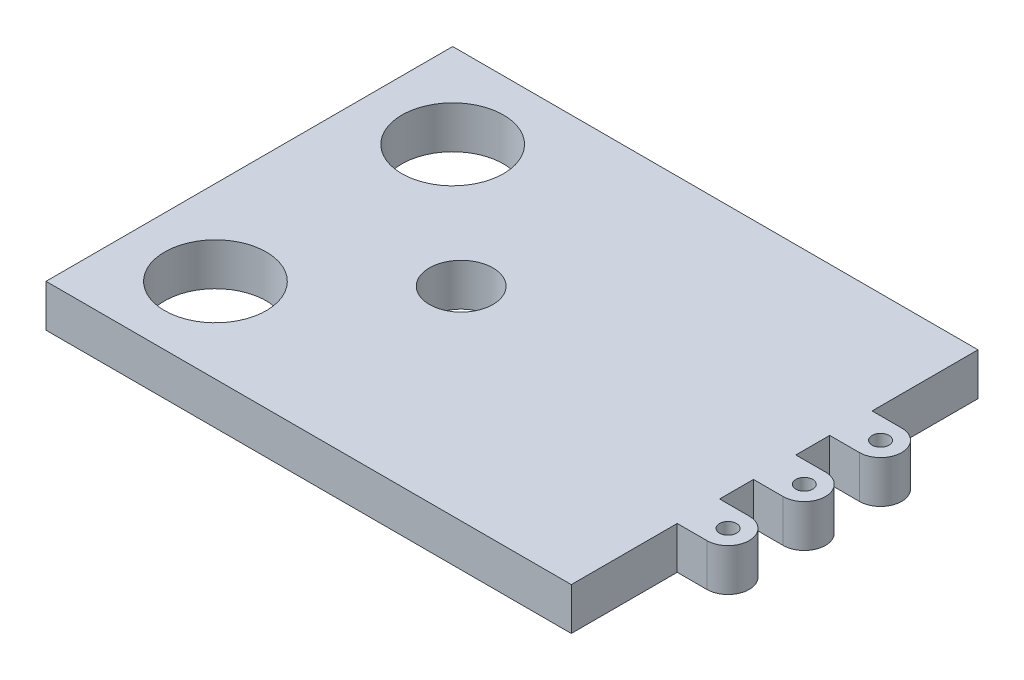
ISO-10303-21;
HEADER;
FILE_DESCRIPTION(('STEP AP214'),'2;1');
FILE_NAME('part.step','',(''),(''),'','','');
FILE_SCHEMA(('AUTOMOTIVE_DESIGN { 1 0 10303 214 1 1 1 1 }'));
ENDSEC;
DATA;
#1=APPLICATION_CONTEXT('core data for automotive mechanical design processes');
#2=APPLICATION_PROTOCOL_DEFINITION('international standard','automotive_design',2000,#1);
#3=PRODUCT_CONTEXT('',#1,'mechanical');
#4=PRODUCT('Part','Part','',(#3));
#5=PRODUCT_RELATED_PRODUCT_CATEGORY('part','',(#4));
#6=PRODUCT_DEFINITION_FORMATION('','',#4);
#7=PRODUCT_DEFINITION_CONTEXT('part definition',#1,'design');
#8=PRODUCT_DEFINITION('design','',#6,#7);
#9=PRODUCT_DEFINITION_SHAPE('','',#8);
#10=(LENGTH_UNIT() NAMED_UNIT(*) SI_UNIT(.MILLI.,.METRE.));
#11=(NAMED_UNIT(*) PLANE_ANGLE_UNIT() SI_UNIT($,.RADIAN.));
#12=(NAMED_UNIT(*) SI_UNIT($,.STERADIAN.) SOLID_ANGLE_UNIT());
#13=UNCERTAINTY_MEASURE_WITH_UNIT(LENGTH_MEASURE(1.E-05),#10,'distance_accuracy_value','');
#14=(GEOMETRIC_REPRESENTATION_CONTEXT(3) GLOBAL_UNCERTAINTY_ASSIGNED_CONTEXT((#13)) GLOBAL_UNIT_ASSIGNED_CONTEXT((#10,
#11,#12)) REPRESENTATION_CONTEXT('',''));
#15=CARTESIAN_POINT('',(0.,0.,0.));
#16=DIRECTION('',(0.,0.,1.));
#17=DIRECTION('',(1.,0.,0.));
#18=AXIS2_PLACEMENT_3D('',#15,#16,#17);
#19=CARTESIAN_POINT('',(0.,5.,-12.5));
#20=DIRECTION('',(0.,0.,1.));
#21=DIRECTION('',(1.,0.,0.));
#22=AXIS2_PLACEMENT_3D('',#19,#20,#21);
#23=PLANE('',#22);
#24=DIRECTION('',(-1.,0.,0.));
#25=VECTOR('',#24,1.);
#26=CARTESIAN_POINT('',(0.,0.,-12.5));
#27=LINE('',#26,#25);
#28=CARTESIAN_POINT('',(65.5,0.,-12.5));
#29=VERTEX_POINT('',#28);
#30=CARTESIAN_POINT('',(62.,0.,-12.5));
#31=VERTEX_POINT('',#30);
#32=EDGE_CURVE('E196',#29,#31,#27,.T.);
#33=ORIENTED_EDGE('',*,*,#32,.F.);
#34=DIRECTION('',(0.,-1.,0.));
#35=VECTOR('',#34,1.);
#36=CARTESIAN_POINT('',(65.5,5.,-12.5));
#37=LINE('',#36,#35);
#38=CARTESIAN_POINT('',(65.5,5.,-12.5));
#39=VERTEX_POINT('',#38);
#40=EDGE_CURVE('E11',#39,#29,#37,.T.);
#41=ORIENTED_EDGE('',*,*,#40,.F.);
#42=DIRECTION('',(-1.,0.,0.));
#43=VECTOR('',#42,1.);
#44=CARTESIAN_POINT('',(0.,5.,-12.5));
#45=LINE('',#44,#43);
#46=CARTESIAN_POINT('',(62.,5.,-12.5));
#47=VERTEX_POINT('',#46);
#48=EDGE_CURVE('E567',#39,#47,#45,.T.);
#49=ORIENTED_EDGE('',*,*,#48,.T.);
#50=DIRECTION('',(0.,-1.,0.));
#51=VECTOR('',#50,1.);
#52=CARTESIAN_POINT('',(62.,5.,-12.5));
#53=LINE('',#52,#51);
#54=EDGE_CURVE('E50',#47,#31,#53,.T.);
#55=ORIENTED_EDGE('',*,*,#54,.T.);
#56=EDGE_LOOP('',(#33,#41,#49,#55));
#57=FACE_BOUND('',#56,.T.);
#58=ADVANCED_FACE('F33',(#57),#23,.T.);
#59=CARTESIAN_POINT('',(65.5,5.,-15.));
#60=DIRECTION('',(0.,-1.,0.));
#61=DIRECTION('',(0.,0.,-1.));
#62=AXIS2_PLACEMENT_3D('',#59,#60,#61);
#63=CYLINDRICAL_SURFACE('',#62,2.50000000000001);
#64=CARTESIAN_POINT('',(65.5,0.,-15.));
#65=DIRECTION('',(0.,1.,0.));
#66=DIRECTION('',(0.,0.,1.));
#67=AXIS2_PLACEMENT_3D('',#64,#65,#66);
#68=CIRCLE('',#67,2.50000000000001);
#69=CARTESIAN_POINT('',(65.5,0.,-17.5));
#70=VERTEX_POINT('',#69);
#71=EDGE_CURVE('E198',#29,#70,#68,.T.);
#72=ORIENTED_EDGE('',*,*,#71,.T.);
#73=DIRECTION('',(0.,-1.,0.));
#74=VECTOR('',#73,1.);
#75=CARTESIAN_POINT('',(65.5,5.,-17.5));
#76=LINE('',#75,#74);
#77=CARTESIAN_POINT('',(65.5,5.,-17.5));
#78=VERTEX_POINT('',#77);
#79=EDGE_CURVE('E42',#78,#70,#76,.T.);
#80=ORIENTED_EDGE('',*,*,#79,.F.);
#81=CARTESIAN_POINT('',(65.5,5.,-15.));
#82=DIRECTION('',(0.,1.,0.));
#83=DIRECTION('',(0.,0.,1.));
#84=AXIS2_PLACEMENT_3D('',#81,#82,#83);
#85=CIRCLE('',#84,2.50000000000001);
#86=EDGE_CURVE('E565',#39,#78,#85,.T.);
#87=ORIENTED_EDGE('',*,*,#86,.F.);
#88=ORIENTED_EDGE('',*,*,#40,.T.);
#89=EDGE_LOOP('',(#72,#80,#87,#88));
#90=FACE_BOUND('',#89,.T.);
#91=ADVANCED_FACE('F273',(#90),#63,.T.);
#92=CARTESIAN_POINT('',(0.,5.,-17.5));
#93=DIRECTION('',(0.,0.,1.));
#94=DIRECTION('',(1.,0.,0.));
#95=AXIS2_PLACEMENT_3D('',#92,#93,#94);
#96=PLANE('',#95);
#97=DIRECTION('',(-1.,0.,0.));
#98=VECTOR('',#97,1.);
#99=CARTESIAN_POINT('',(0.,0.,-17.5));
#100=LINE('',#99,#98);
#101=CARTESIAN_POINT('',(62.,0.,-17.5));
#102=VERTEX_POINT('',#101);
#103=EDGE_CURVE('E201',#70,#102,#100,.T.);
#104=ORIENTED_EDGE('',*,*,#103,.T.);
#105=DIRECTION('',(0.,-1.,0.));
#106=VECTOR('',#105,1.);
#107=CARTESIAN_POINT('',(62.,5.,-17.5));
#108=LINE('',#107,#106);
#109=CARTESIAN_POINT('',(62.,5.,-17.5));
#110=VERTEX_POINT('',#109);
#111=EDGE_CURVE('E263',#110,#102,#108,.T.);
#112=ORIENTED_EDGE('',*,*,#111,.F.);
#113=DIRECTION('',(-1.,0.,0.));
#114=VECTOR('',#113,1.);
#115=CARTESIAN_POINT('',(0.,5.,-17.5));
#116=LINE('',#115,#114);
#117=EDGE_CURVE('E269',#78,#110,#116,.T.);
#118=ORIENTED_EDGE('',*,*,#117,.F.);
#119=ORIENTED_EDGE('',*,*,#79,.T.);
#120=EDGE_LOOP('',(#104,#112,#118,#119));
#121=FACE_BOUND('',#120,.T.);
#122=ADVANCED_FACE('F267',(#121),#96,.F.);
#123=CARTESIAN_POINT('',(62.,5.,0.));
#124=DIRECTION('',(1.,0.,0.));
#125=DIRECTION('',(0.,0.,-1.));
#126=AXIS2_PLACEMENT_3D('',#123,#124,#125);
#127=PLANE('',#126);
#128=DIRECTION('',(0.,0.,1.));
#129=VECTOR('',#128,1.);
#130=CARTESIAN_POINT('',(62.,0.,0.));
#131=LINE('',#130,#129);
#132=CARTESIAN_POINT('',(62.,0.,-21.5));
#133=VERTEX_POINT('',#132);
#134=EDGE_CURVE('E204',#133,#102,#131,.T.);
#135=ORIENTED_EDGE('',*,*,#134,.F.);
#136=DIRECTION('',(0.,-1.,0.));
#137=VECTOR('',#136,1.);
#138=CARTESIAN_POINT('',(62.,5.,-21.5));
#139=LINE('',#138,#137);
#140=CARTESIAN_POINT('',(62.,5.,-21.5));
#141=VERTEX_POINT('',#140);
#142=EDGE_CURVE('E261',#141,#133,#139,.T.);
#143=ORIENTED_EDGE('',*,*,#142,.F.);
#144=DIRECTION('',(0.,0.,1.));
#145=VECTOR('',#144,1.);
#146=CARTESIAN_POINT('',(62.,5.,0.));
#147=LINE('',#146,#145);
#148=EDGE_CURVE('E531',#141,#110,#147,.T.);
#149=ORIENTED_EDGE('',*,*,#148,.T.);
#150=ORIENTED_EDGE('',*,*,#111,.T.);
#151=EDGE_LOOP('',(#135,#143,#149,#150));
#152=FACE_BOUND('',#151,.T.);
#153=ADVANCED_FACE('F375',(#152),#127,.T.);
#154=CARTESIAN_POINT('',(0.,5.,-21.5));
#155=DIRECTION('',(0.,0.,1.));
#156=DIRECTION('',(1.,0.,0.));
#157=AXIS2_PLACEMENT_3D('',#154,#155,#156);
#158=PLANE('',#157);
#159=DIRECTION('',(-1.,0.,0.));
#160=VECTOR('',#159,1.);
#161=CARTESIAN_POINT('',(0.,0.,-21.5));
#162=LINE('',#161,#160);
#163=CARTESIAN_POINT('',(65.5,0.,-21.5));
#164=VERTEX_POINT('',#163);
#165=EDGE_CURVE('E207',#164,#133,#162,.T.);
#166=ORIENTED_EDGE('',*,*,#165,.F.);
#167=DIRECTION('',(0.,-1.,0.));
#168=VECTOR('',#167,1.);
#169=CARTESIAN_POINT('',(65.5,5.,-21.5));
#170=LINE('',#169,#168);
#171=CARTESIAN_POINT('',(65.5,5.,-21.5));
#172=VERTEX_POINT('',#171);
#173=EDGE_CURVE('E259',#172,#164,#170,.T.);
#174=ORIENTED_EDGE('',*,*,#173,.F.);
#175=DIRECTION('',(-1.,0.,0.));
#176=VECTOR('',#175,1.);
#177=CARTESIAN_POINT('',(0.,5.,-21.5));
#178=LINE('',#177,#176);
#179=EDGE_CURVE('E529',#172,#141,#178,.T.);
#180=ORIENTED_EDGE('',*,*,#179,.T.);
#181=ORIENTED_EDGE('',*,*,#142,.T.);
#182=EDGE_LOOP('',(#166,#174,#180,#181));
#183=FACE_BOUND('',#182,.T.);
#184=ADVANCED_FACE('F371',(#183),#158,.T.);
#185=CARTESIAN_POINT('',(65.5,5.,-24.));
#186=DIRECTION('',(0.,-1.,0.));
#187=DIRECTION('',(0.,0.,-1.));
#188=AXIS2_PLACEMENT_3D('',#185,#186,#187);
#189=CYLINDRICAL_SURFACE('',#188,2.50000000000001);
#190=CARTESIAN_POINT('',(65.5,0.,-24.));
#191=DIRECTION('',(0.,1.,0.));
#192=DIRECTION('',(0.,0.,1.));
#193=AXIS2_PLACEMENT_3D('',#190,#191,#192);
#194=CIRCLE('',#193,2.50000000000001);
#195=CARTESIAN_POINT('',(65.5,0.,-26.5));
#196=VERTEX_POINT('',#195);
#197=EDGE_CURVE('E210',#164,#196,#194,.T.);
#198=ORIENTED_EDGE('',*,*,#197,.T.);
#199=DIRECTION('',(0.,-1.,0.));
#200=VECTOR('',#199,1.);
#201=CARTESIAN_POINT('',(65.5,5.,-26.5));
#202=LINE('',#201,#200);
#203=CARTESIAN_POINT('',(65.5,5.,-26.5));
#204=VERTEX_POINT('',#203);
#205=EDGE_CURVE('E257',#204,#196,#202,.T.);
#206=ORIENTED_EDGE('',*,*,#205,.F.);
#207=CARTESIAN_POINT('',(65.5,5.,-24.));
#208=DIRECTION('',(0.,1.,0.));
#209=DIRECTION('',(0.,0.,1.));
#210=AXIS2_PLACEMENT_3D('',#207,#208,#209);
#211=CIRCLE('',#210,2.50000000000001);
#212=EDGE_CURVE('E530',#172,#204,#211,.T.);
#213=ORIENTED_EDGE('',*,*,#212,.F.);
#214=ORIENTED_EDGE('',*,*,#173,.T.);
#215=EDGE_LOOP('',(#198,#206,#213,#214));
#216=FACE_BOUND('',#215,.T.);
#217=ADVANCED_FACE('F367',(#216),#189,.T.);
#218=CARTESIAN_POINT('',(0.,5.,-26.5));
#219=DIRECTION('',(0.,0.,-1.));
#220=DIRECTION('',(-1.,0.,0.));
#221=AXIS2_PLACEMENT_3D('',#218,#219,#220);
#222=PLANE('',#221);
#223=DIRECTION('',(1.,0.,0.));
#224=VECTOR('',#223,1.);
#225=CARTESIAN_POINT('',(0.,0.,-26.5));
#226=LINE('',#225,#224);
#227=CARTESIAN_POINT('',(62.,0.,-26.5));
#228=VERTEX_POINT('',#227);
#229=EDGE_CURVE('E213',#228,#196,#226,.T.);
#230=ORIENTED_EDGE('',*,*,#229,.F.);
#231=DIRECTION('',(0.,-1.,0.));
#232=VECTOR('',#231,1.);
#233=CARTESIAN_POINT('',(62.,5.,-26.5));
#234=LINE('',#233,#232);
#235=CARTESIAN_POINT('',(62.,5.,-26.5));
#236=VERTEX_POINT('',#235);
#237=EDGE_CURVE('E255',#236,#228,#234,.T.);
#238=ORIENTED_EDGE('',*,*,#237,.F.);
#239=DIRECTION('',(1.,0.,0.));
#240=VECTOR('',#239,1.);
#241=CARTESIAN_POINT('',(0.,5.,-26.5));
#242=LINE('',#241,#240);
#243=EDGE_CURVE('E533',#236,#204,#242,.T.);
#244=ORIENTED_EDGE('',*,*,#243,.T.);
#245=ORIENTED_EDGE('',*,*,#205,.T.);
#246=EDGE_LOOP('',(#230,#238,#244,#245));
#247=FACE_BOUND('',#246,.T.);
#248=ADVANCED_FACE('F363',(#247),#222,.T.);
#249=CARTESIAN_POINT('',(62.,5.,0.));
#250=DIRECTION('',(1.,0.,0.));
#251=DIRECTION('',(0.,0.,-1.));
#252=AXIS2_PLACEMENT_3D('',#249,#250,#251);
#253=PLANE('',#252);
#254=DIRECTION('',(0.,0.,1.));
#255=VECTOR('',#254,1.);
#256=CARTESIAN_POINT('',(62.,0.,0.));
#257=LINE('',#256,#255);
#258=CARTESIAN_POINT('',(62.,0.,-30.5));
#259=VERTEX_POINT('',#258);
#260=EDGE_CURVE('E216',#259,#228,#257,.T.);
#261=ORIENTED_EDGE('',*,*,#260,.F.);
#262=DIRECTION('',(0.,-1.,0.));
#263=VECTOR('',#262,1.);
#264=CARTESIAN_POINT('',(62.,5.,-30.5));
#265=LINE('',#264,#263);
#266=CARTESIAN_POINT('',(62.,5.,-30.5));
#267=VERTEX_POINT('',#266);
#268=EDGE_CURVE('E253',#267,#259,#265,.T.);
#269=ORIENTED_EDGE('',*,*,#268,.F.);
#270=DIRECTION('',(0.,0.,1.));
#271=VECTOR('',#270,1.);
#272=CARTESIAN_POINT('',(62.,5.,0.));
#273=LINE('',#272,#271);
#274=EDGE_CURVE('E540',#267,#236,#273,.T.);
#275=ORIENTED_EDGE('',*,*,#274,.T.);
#276=ORIENTED_EDGE('',*,*,#237,.T.);
#277=EDGE_LOOP('',(#261,#269,#275,#276));
#278=FACE_BOUND('',#277,.T.);
#279=ADVANCED_FACE('F359',(#278),#253,.T.);
#280=CARTESIAN_POINT('',(0.,5.,-30.5));
#281=DIRECTION('',(0.,0.,1.));
#282=DIRECTION('',(1.,0.,0.));
#283=AXIS2_PLACEMENT_3D('',#280,#281,#282);
#284=PLANE('',#283);
#285=DIRECTION('',(-1.,0.,0.));
#286=VECTOR('',#285,1.);
#287=CARTESIAN_POINT('',(0.,0.,-30.5));
#288=LINE('',#287,#286);
#289=CARTESIAN_POINT('',(65.5,0.,-30.5));
#290=VERTEX_POINT('',#289);
#291=EDGE_CURVE('E219',#290,#259,#288,.T.);
#292=ORIENTED_EDGE('',*,*,#291,.F.);
#293=DIRECTION('',(0.,-1.,0.));
#294=VECTOR('',#293,1.);
#295=CARTESIAN_POINT('',(65.5,5.,-30.5));
#296=LINE('',#295,#294);
#297=CARTESIAN_POINT('',(65.5,5.,-30.5));
#298=VERTEX_POINT('',#297);
#299=EDGE_CURVE('E251',#298,#290,#296,.T.);
#300=ORIENTED_EDGE('',*,*,#299,.F.);
#301=DIRECTION('',(-1.,0.,0.));
#302=VECTOR('',#301,1.);
#303=CARTESIAN_POINT('',(0.,5.,-30.5));
#304=LINE('',#303,#302);
#305=EDGE_CURVE('E543',#298,#267,#304,.T.);
#306=ORIENTED_EDGE('',*,*,#305,.T.);
#307=ORIENTED_EDGE('',*,*,#268,.T.);
#308=EDGE_LOOP('',(#292,#300,#306,#307));
#309=FACE_BOUND('',#308,.T.);
#310=ADVANCED_FACE('F355',(#309),#284,.T.);
#311=CARTESIAN_POINT('',(65.5,5.,-33.));
#312=DIRECTION('',(0.,-1.,0.));
#313=DIRECTION('',(0.,0.,-1.));
#314=AXIS2_PLACEMENT_3D('',#311,#312,#313);
#315=CYLINDRICAL_SURFACE('',#314,2.50000000000001);
#316=CARTESIAN_POINT('',(65.5,0.,-33.));
#317=DIRECTION('',(0.,1.,0.));
#318=DIRECTION('',(0.,0.,1.));
#319=AXIS2_PLACEMENT_3D('',#316,#317,#318);
#320=CIRCLE('',#319,2.50000000000001);
#321=CARTESIAN_POINT('',(65.5,0.,-35.5));
#322=VERTEX_POINT('',#321);
#323=EDGE_CURVE('E222',#290,#322,#320,.T.);
#324=ORIENTED_EDGE('',*,*,#323,.T.);
#325=DIRECTION('',(0.,-1.,0.));
#326=VECTOR('',#325,1.);
#327=CARTESIAN_POINT('',(65.5,5.,-35.5));
#328=LINE('',#327,#326);
#329=CARTESIAN_POINT('',(65.5,5.,-35.5));
#330=VERTEX_POINT('',#329);
#331=EDGE_CURVE('E248',#330,#322,#328,.T.);
#332=ORIENTED_EDGE('',*,*,#331,.F.);
#333=CARTESIAN_POINT('',(65.5,5.,-33.));
#334=DIRECTION('',(0.,1.,0.));
#335=DIRECTION('',(0.,0.,1.));
#336=AXIS2_PLACEMENT_3D('',#333,#334,#335);
#337=CIRCLE('',#336,2.50000000000001);
#338=EDGE_CURVE('E546',#298,#330,#337,.T.);
#339=ORIENTED_EDGE('',*,*,#338,.F.);
#340=ORIENTED_EDGE('',*,*,#299,.T.);
#341=EDGE_LOOP('',(#324,#332,#339,#340));
#342=FACE_BOUND('',#341,.T.);
#343=ADVANCED_FACE('F351',(#342),#315,.T.);
#344=CARTESIAN_POINT('',(0.,5.,-35.5));
#345=DIRECTION('',(0.,0.,1.));
#346=DIRECTION('',(1.,0.,0.));
#347=AXIS2_PLACEMENT_3D('',#344,#345,#346);
#348=PLANE('',#347);
#349=DIRECTION('',(-1.,0.,0.));
#350=VECTOR('',#349,1.);
#351=CARTESIAN_POINT('',(0.,0.,-35.5));
#352=LINE('',#351,#350);
#353=CARTESIAN_POINT('',(62.,0.,-35.5));
#354=VERTEX_POINT('',#353);
#355=EDGE_CURVE('E225',#322,#354,#352,.T.);
#356=ORIENTED_EDGE('',*,*,#355,.T.);
#357=DIRECTION('',(0.,-1.,0.));
#358=VECTOR('',#357,1.);
#359=CARTESIAN_POINT('',(62.,5.,-35.5));
#360=LINE('',#359,#358);
#361=CARTESIAN_POINT('',(62.,5.,-35.5));
#362=VERTEX_POINT('',#361);
#363=EDGE_CURVE('E246',#362,#354,#360,.T.);
#364=ORIENTED_EDGE('',*,*,#363,.F.);
#365=DIRECTION('',(-1.,0.,0.));
#366=VECTOR('',#365,1.);
#367=CARTESIAN_POINT('',(0.,5.,-35.5));
#368=LINE('',#367,#366);
#369=EDGE_CURVE('E549',#330,#362,#368,.T.);
#370=ORIENTED_EDGE('',*,*,#369,.F.);
#371=ORIENTED_EDGE('',*,*,#331,.T.);
#372=EDGE_LOOP('',(#356,#364,#370,#371));
#373=FACE_BOUND('',#372,.T.);
#374=ADVANCED_FACE('F347',(#373),#348,.F.);
#375=CARTESIAN_POINT('',(62.,5.,0.));
#376=DIRECTION('',(1.,0.,0.));
#377=DIRECTION('',(0.,0.,-1.));
#378=AXIS2_PLACEMENT_3D('',#375,#376,#377);
#379=PLANE('',#378);
#380=DIRECTION('',(0.,0.,1.));
#381=VECTOR('',#380,1.);
#382=CARTESIAN_POINT('',(62.,0.,0.));
#383=LINE('',#382,#381);
#384=CARTESIAN_POINT('',(62.,0.,-48.));
#385=VERTEX_POINT('',#384);
#386=EDGE_CURVE('E228',#385,#354,#383,.T.);
#387=ORIENTED_EDGE('',*,*,#386,.F.);
#388=DIRECTION('',(0.,-1.,0.));
#389=VECTOR('',#388,1.);
#390=CARTESIAN_POINT('',(62.,5.,-48.));
#391=LINE('',#390,#389);
#392=CARTESIAN_POINT('',(62.,5.,-48.));
#393=VERTEX_POINT('',#392);
#394=EDGE_CURVE('E244',#393,#385,#391,.T.);
#395=ORIENTED_EDGE('',*,*,#394,.F.);
#396=DIRECTION('',(0.,0.,1.));
#397=VECTOR('',#396,1.);
#398=CARTESIAN_POINT('',(62.,5.,0.));
#399=LINE('',#398,#397);
#400=EDGE_CURVE('E173',#393,#362,#399,.T.);
#401=ORIENTED_EDGE('',*,*,#400,.T.);
#402=ORIENTED_EDGE('',*,*,#363,.T.);
#403=EDGE_LOOP('',(#387,#395,#401,#402));
#404=FACE_BOUND('',#403,.T.);
#405=ADVANCED_FACE('F343',(#404),#379,.T.);
#406=CARTESIAN_POINT('',(0.,5.,-48.));
#407=DIRECTION('',(0.,0.,-1.));
#408=DIRECTION('',(-1.,0.,0.));
#409=AXIS2_PLACEMENT_3D('',#406,#407,#408);
#410=PLANE('',#409);
#411=DIRECTION('',(1.,0.,0.));
#412=VECTOR('',#411,1.);
#413=CARTESIAN_POINT('',(0.,0.,-48.));
#414=LINE('',#413,#412);
#415=CARTESIAN_POINT('',(0.,0.,-48.));
#416=VERTEX_POINT('',#415);
#417=EDGE_CURVE('E231',#416,#385,#414,.T.);
#418=ORIENTED_EDGE('',*,*,#417,.F.);
#419=DIRECTION('',(0.,-1.,0.));
#420=VECTOR('',#419,1.);
#421=CARTESIAN_POINT('',(0.,5.,-48.));
#422=LINE('',#421,#420);
#423=CARTESIAN_POINT('',(0.,5.,-48.));
#424=VERTEX_POINT('',#423);
#425=EDGE_CURVE('E158',#424,#416,#422,.T.);
#426=ORIENTED_EDGE('',*,*,#425,.F.);
#427=DIRECTION('',(1.,0.,0.));
#428=VECTOR('',#427,1.);
#429=CARTESIAN_POINT('',(0.,5.,-48.));
#430=LINE('',#429,#428);
#431=EDGE_CURVE('E171',#424,#393,#430,.T.);
#432=ORIENTED_EDGE('',*,*,#431,.T.);
#433=ORIENTED_EDGE('',*,*,#394,.T.);
#434=EDGE_LOOP('',(#418,#426,#432,#433));
#435=FACE_BOUND('',#434,.T.);
#436=ADVANCED_FACE('F340',(#435),#410,.T.);
#437=CARTESIAN_POINT('',(0.,5.,0.));
#438=DIRECTION('',(-1.,0.,0.));
#439=DIRECTION('',(0.,0.,1.));
#440=AXIS2_PLACEMENT_3D('',#437,#438,#439);
#441=PLANE('',#440);
#442=DIRECTION('',(0.,0.,-1.));
#443=VECTOR('',#442,1.);
#444=CARTESIAN_POINT('',(0.,0.,0.));
#445=LINE('',#444,#443);
#446=CARTESIAN_POINT('',(0.,0.,0.));
#447=VERTEX_POINT('',#446);
#448=EDGE_CURVE('E155',#447,#416,#445,.T.);
#449=ORIENTED_EDGE('',*,*,#448,.F.);
#450=DIRECTION('',(0.,-1.,0.));
#451=VECTOR('',#450,1.);
#452=CARTESIAN_POINT('',(0.,5.,0.));
#453=LINE('',#452,#451);
#454=CARTESIAN_POINT('',(0.,5.,0.));
#455=VERTEX_POINT('',#454);
#456=EDGE_CURVE('E149',#455,#447,#453,.T.);
#457=ORIENTED_EDGE('',*,*,#456,.F.);
#458=DIRECTION('',(0.,0.,-1.));
#459=VECTOR('',#458,1.);
#460=CARTESIAN_POINT('',(0.,5.,0.));
#461=LINE('',#460,#459);
#462=EDGE_CURVE('E153',#455,#424,#461,.T.);
#463=ORIENTED_EDGE('',*,*,#462,.T.);
#464=ORIENTED_EDGE('',*,*,#425,.T.);
#465=EDGE_LOOP('',(#449,#457,#463,#464));
#466=FACE_BOUND('',#465,.T.);
#467=ADVANCED_FACE('F151',(#466),#441,.T.);
#468=CARTESIAN_POINT('',(0.,5.,0.));
#469=DIRECTION('',(0.,0.,-1.));
#470=DIRECTION('',(-1.,0.,0.));
#471=AXIS2_PLACEMENT_3D('',#468,#469,#470);
#472=PLANE('',#471);
#473=DIRECTION('',(1.,0.,0.));
#474=VECTOR('',#473,1.);
#475=CARTESIAN_POINT('',(0.,0.,0.));
#476=LINE('',#475,#474);
#477=CARTESIAN_POINT('',(62.,0.,0.));
#478=VERTEX_POINT('',#477);
#479=EDGE_CURVE('E235',#447,#478,#476,.T.);
#480=ORIENTED_EDGE('',*,*,#479,.T.);
#481=DIRECTION('',(0.,-1.,0.));
#482=VECTOR('',#481,1.);
#483=CARTESIAN_POINT('',(62.,5.,0.));
#484=LINE('',#483,#482);
#485=CARTESIAN_POINT('',(62.,5.,0.));
#486=VERTEX_POINT('',#485);
#487=EDGE_CURVE('E100',#486,#478,#484,.T.);
#488=ORIENTED_EDGE('',*,*,#487,.F.);
#489=DIRECTION('',(1.,0.,0.));
#490=VECTOR('',#489,1.);
#491=CARTESIAN_POINT('',(0.,5.,0.));
#492=LINE('',#491,#490);
#493=EDGE_CURVE('E160',#455,#486,#492,.T.);
#494=ORIENTED_EDGE('',*,*,#493,.F.);
#495=ORIENTED_EDGE('',*,*,#456,.T.);
#496=EDGE_LOOP('',(#480,#488,#494,#495));
#497=FACE_BOUND('',#496,.T.);
#498=ADVANCED_FACE('F161',(#497),#472,.F.);
#499=CARTESIAN_POINT('',(65.5,5.,-33.));
#500=DIRECTION('',(0.,-1.,0.));
#501=DIRECTION('',(0.,0.,-1.));
#502=AXIS2_PLACEMENT_3D('',#499,#500,#501);
#503=CYLINDRICAL_SURFACE('',#502,0.999999999999998);
#504=CARTESIAN_POINT('',(65.5,5.,-33.));
#505=DIRECTION('',(0.,1.,0.));
#506=DIRECTION('',(0.,0.,1.));
#507=AXIS2_PLACEMENT_3D('',#504,#505,#506);
#508=CIRCLE('',#507,0.999999999999998);
#509=CARTESIAN_POINT('',(65.5,5.,-32.));
#510=VERTEX_POINT('',#509);
#511=EDGE_CURVE('E569',#510,#510,#508,.T.);
#512=ORIENTED_EDGE('',*,*,#511,.T.);
#513=EDGE_LOOP('',(#512));
#514=FACE_BOUND('',#513,.T.);
#515=CARTESIAN_POINT('',(65.5,0.,-33.));
#516=DIRECTION('',(0.,1.,0.));
#517=DIRECTION('',(0.,0.,1.));
#518=AXIS2_PLACEMENT_3D('',#515,#516,#517);
#519=CIRCLE('',#518,0.999999999999998);
#520=CARTESIAN_POINT('',(65.5,0.,-32.));
#521=VERTEX_POINT('',#520);
#522=EDGE_CURVE('E193',#521,#521,#519,.T.);
#523=ORIENTED_EDGE('',*,*,#522,.F.);
#524=EDGE_LOOP('',(#523));
#525=FACE_BOUND('',#524,.T.);
#526=ADVANCED_FACE('F284',(#514,#525),#503,.F.);
#527=CARTESIAN_POINT('',(65.5,5.,-24.));
#528=DIRECTION('',(0.,-1.,0.));
#529=DIRECTION('',(0.,0.,-1.));
#530=AXIS2_PLACEMENT_3D('',#527,#528,#529);
#531=CYLINDRICAL_SURFACE('',#530,0.999999999999998);
#532=CARTESIAN_POINT('',(65.5,5.,-24.));
#533=DIRECTION('',(0.,1.,0.));
#534=DIRECTION('',(0.,0.,1.));
#535=AXIS2_PLACEMENT_3D('',#532,#533,#534);
#536=CIRCLE('',#535,0.999999999999998);
#537=CARTESIAN_POINT('',(65.5,5.,-23.));
#538=VERTEX_POINT('',#537);
#539=EDGE_CURVE('E572',#538,#538,#536,.T.);
#540=ORIENTED_EDGE('',*,*,#539,.T.);
#541=EDGE_LOOP('',(#540));
#542=FACE_BOUND('',#541,.T.);
#543=CARTESIAN_POINT('',(65.5,0.,-24.));
#544=DIRECTION('',(0.,1.,0.));
#545=DIRECTION('',(0.,0.,1.));
#546=AXIS2_PLACEMENT_3D('',#543,#544,#545);
#547=CIRCLE('',#546,0.999999999999998);
#548=CARTESIAN_POINT('',(65.5,0.,-23.));
#549=VERTEX_POINT('',#548);
#550=EDGE_CURVE('E190',#549,#549,#547,.T.);
#551=ORIENTED_EDGE('',*,*,#550,.F.);
#552=EDGE_LOOP('',(#551));
#553=FACE_BOUND('',#552,.T.);
#554=ADVANCED_FACE('F287',(#542,#553),#531,.F.);
#555=CARTESIAN_POINT('',(65.5,5.,-15.));
#556=DIRECTION('',(0.,-1.,0.));
#557=DIRECTION('',(0.,0.,-1.));
#558=AXIS2_PLACEMENT_3D('',#555,#556,#557);
#559=CYLINDRICAL_SURFACE('',#558,0.999999999999998);
#560=CARTESIAN_POINT('',(65.5,5.,-15.));
#561=DIRECTION('',(0.,1.,0.));
#562=DIRECTION('',(0.,0.,1.));
#563=AXIS2_PLACEMENT_3D('',#560,#561,#562);
#564=CIRCLE('',#563,0.999999999999998);
#565=CARTESIAN_POINT('',(65.5,5.,-14.));
#566=VERTEX_POINT('',#565);
#567=EDGE_CURVE('E575',#566,#566,#564,.T.);
#568=ORIENTED_EDGE('',*,*,#567,.T.);
#569=EDGE_LOOP('',(#568));
#570=FACE_BOUND('',#569,.T.);
#571=CARTESIAN_POINT('',(65.5,0.,-15.));
#572=DIRECTION('',(0.,1.,0.));
#573=DIRECTION('',(0.,0.,1.));
#574=AXIS2_PLACEMENT_3D('',#571,#572,#573);
#575=CIRCLE('',#574,0.999999999999998);
#576=CARTESIAN_POINT('',(65.5,0.,-14.));
#577=VERTEX_POINT('',#576);
#578=EDGE_CURVE('E187',#577,#577,#575,.T.);
#579=ORIENTED_EDGE('',*,*,#578,.F.);
#580=EDGE_LOOP('',(#579));
#581=FACE_BOUND('',#580,.T.);
#582=ADVANCED_FACE('F291',(#570,#581),#559,.F.);
#583=CARTESIAN_POINT('',(25.,5.,-24.));
#584=DIRECTION('',(0.,-1.,0.));
#585=DIRECTION('',(0.,0.,-1.));
#586=AXIS2_PLACEMENT_3D('',#583,#584,#585);
#587=CYLINDRICAL_SURFACE('',#586,3.75);
#588=CARTESIAN_POINT('',(25.,5.,-24.));
#589=DIRECTION('',(0.,1.,0.));
#590=DIRECTION('',(0.,0.,1.));
#591=AXIS2_PLACEMENT_3D('',#588,#589,#590);
#592=CIRCLE('',#591,3.75);
#593=CARTESIAN_POINT('',(25.,5.,-20.25));
#594=VERTEX_POINT('',#593);
#595=EDGE_CURVE('E578',#594,#594,#592,.T.);
#596=ORIENTED_EDGE('',*,*,#595,.T.);
#597=EDGE_LOOP('',(#596));
#598=FACE_BOUND('',#597,.T.);
#599=CARTESIAN_POINT('',(25.,0.,-24.));
#600=DIRECTION('',(0.,1.,0.));
#601=DIRECTION('',(0.,0.,1.));
#602=AXIS2_PLACEMENT_3D('',#599,#600,#601);
#603=CIRCLE('',#602,3.75);
#604=CARTESIAN_POINT('',(25.,0.,-20.25));
#605=VERTEX_POINT('',#604);
#606=EDGE_CURVE('E184',#605,#605,#603,.T.);
#607=ORIENTED_EDGE('',*,*,#606,.F.);
#608=EDGE_LOOP('',(#607));
#609=FACE_BOUND('',#608,.T.);
#610=ADVANCED_FACE('F295',(#598,#609),#587,.F.);
#611=CARTESIAN_POINT('',(10.,5.,-38.));
#612=DIRECTION('',(0.,-1.,0.));
#613=DIRECTION('',(0.,0.,-1.));
#614=AXIS2_PLACEMENT_3D('',#611,#612,#613);
#615=CYLINDRICAL_SURFACE('',#614,6.);
#616=CARTESIAN_POINT('',(10.,5.,-38.));
#617=DIRECTION('',(0.,1.,0.));
#618=DIRECTION('',(0.,0.,1.));
#619=AXIS2_PLACEMENT_3D('',#616,#617,#618);
#620=CIRCLE('',#619,6.);
#621=CARTESIAN_POINT('',(10.,5.,-32.));
#622=VERTEX_POINT('',#621);
#623=EDGE_CURVE('E310',#622,#622,#620,.T.);
#624=ORIENTED_EDGE('',*,*,#623,.T.);
#625=EDGE_LOOP('',(#624));
#626=FACE_BOUND('',#625,.T.);
#627=CARTESIAN_POINT('',(10.,0.,-38.));
#628=DIRECTION('',(0.,1.,0.));
#629=DIRECTION('',(0.,0.,1.));
#630=AXIS2_PLACEMENT_3D('',#627,#628,#629);
#631=CIRCLE('',#630,6.);
#632=CARTESIAN_POINT('',(10.,0.,-32.));
#633=VERTEX_POINT('',#632);
#634=EDGE_CURVE('E181',#633,#633,#631,.T.);
#635=ORIENTED_EDGE('',*,*,#634,.F.);
#636=EDGE_LOOP('',(#635));
#637=FACE_BOUND('',#636,.T.);
#638=ADVANCED_FACE('F298',(#626,#637),#615,.F.);
#639=CARTESIAN_POINT('',(10.,5.,-10.));
#640=DIRECTION('',(0.,-1.,0.));
#641=DIRECTION('',(0.,0.,-1.));
#642=AXIS2_PLACEMENT_3D('',#639,#640,#641);
#643=CYLINDRICAL_SURFACE('',#642,6.);
#644=CARTESIAN_POINT('',(10.,5.,-10.));
#645=DIRECTION('',(0.,1.,0.));
#646=DIRECTION('',(0.,0.,1.));
#647=AXIS2_PLACEMENT_3D('',#644,#645,#646);
#648=CIRCLE('',#647,6.);
#649=CARTESIAN_POINT('',(10.,5.,-4.));
#650=VERTEX_POINT('',#649);
#651=EDGE_CURVE('E240',#650,#650,#648,.T.);
#652=ORIENTED_EDGE('',*,*,#651,.T.);
#653=EDGE_LOOP('',(#652));
#654=FACE_BOUND('',#653,.T.);
#655=CARTESIAN_POINT('',(10.,0.,-10.));
#656=DIRECTION('',(0.,1.,0.));
#657=DIRECTION('',(0.,0.,1.));
#658=AXIS2_PLACEMENT_3D('',#655,#656,#657);
#659=CIRCLE('',#658,6.);
#660=CARTESIAN_POINT('',(10.,0.,-4.));
#661=VERTEX_POINT('',#660);
#662=EDGE_CURVE('E178',#661,#661,#659,.T.);
#663=ORIENTED_EDGE('',*,*,#662,.F.);
#664=EDGE_LOOP('',(#663));
#665=FACE_BOUND('',#664,.T.);
#666=ADVANCED_FACE('F35',(#654,#665),#643,.F.);
#667=CARTESIAN_POINT('',(62.,5.,0.));
#668=DIRECTION('',(1.,0.,0.));
#669=DIRECTION('',(0.,0.,-1.));
#670=AXIS2_PLACEMENT_3D('',#667,#668,#669);
#671=PLANE('',#670);
#672=DIRECTION('',(0.,0.,1.));
#673=VECTOR('',#672,1.);
#674=CARTESIAN_POINT('',(62.,0.,0.));
#675=LINE('',#674,#673);
#676=EDGE_CURVE('E237',#31,#478,#675,.T.);
#677=ORIENTED_EDGE('',*,*,#676,.F.);
#678=ORIENTED_EDGE('',*,*,#54,.F.);
#679=DIRECTION('',(0.,0.,1.));
#680=VECTOR('',#679,1.);
#681=CARTESIAN_POINT('',(62.,5.,0.));
#682=LINE('',#681,#680);
#683=EDGE_CURVE('E164',#47,#486,#682,.T.);
#684=ORIENTED_EDGE('',*,*,#683,.T.);
#685=ORIENTED_EDGE('',*,*,#487,.T.);
#686=EDGE_LOOP('',(#677,#678,#684,#685));
#687=FACE_BOUND('',#686,.T.);
#688=ADVANCED_FACE('F305',(#687),#671,.T.);
#689=CARTESIAN_POINT('',(0.,5.,0.));
#690=DIRECTION('',(0.,1.,0.));
#691=DIRECTION('',(0.,0.,1.));
#692=AXIS2_PLACEMENT_3D('',#689,#690,#691);
#693=PLANE('',#692);
#694=ORIENTED_EDGE('',*,*,#651,.F.);
#695=EDGE_LOOP('',(#694));
#696=FACE_BOUND('',#695,.T.);
#697=ORIENTED_EDGE('',*,*,#623,.F.);
#698=EDGE_LOOP('',(#697));
#699=FACE_BOUND('',#698,.T.);
#700=ORIENTED_EDGE('',*,*,#595,.F.);
#701=EDGE_LOOP('',(#700));
#702=FACE_BOUND('',#701,.T.);
#703=ORIENTED_EDGE('',*,*,#567,.F.);
#704=EDGE_LOOP('',(#703));
#705=FACE_BOUND('',#704,.T.);
#706=ORIENTED_EDGE('',*,*,#539,.F.);
#707=EDGE_LOOP('',(#706));
#708=FACE_BOUND('',#707,.T.);
#709=ORIENTED_EDGE('',*,*,#511,.F.);
#710=EDGE_LOOP('',(#709));
#711=FACE_BOUND('',#710,.T.);
#712=ORIENTED_EDGE('',*,*,#48,.F.);
#713=ORIENTED_EDGE('',*,*,#86,.T.);
#714=ORIENTED_EDGE('',*,*,#117,.T.);
#715=ORIENTED_EDGE('',*,*,#148,.F.);
#716=ORIENTED_EDGE('',*,*,#179,.F.);
#717=ORIENTED_EDGE('',*,*,#212,.T.);
#718=ORIENTED_EDGE('',*,*,#243,.F.);
#719=ORIENTED_EDGE('',*,*,#274,.F.);
#720=ORIENTED_EDGE('',*,*,#305,.F.);
#721=ORIENTED_EDGE('',*,*,#338,.T.);
#722=ORIENTED_EDGE('',*,*,#369,.T.);
#723=ORIENTED_EDGE('',*,*,#400,.F.);
#724=ORIENTED_EDGE('',*,*,#431,.F.);
#725=ORIENTED_EDGE('',*,*,#462,.F.);
#726=ORIENTED_EDGE('',*,*,#493,.T.);
#727=ORIENTED_EDGE('',*,*,#683,.F.);
#728=EDGE_LOOP('',(#712,#713,#714,#715,#716,#717,#718,#719,#720,#721,#722,#723,#724,#725,#726,#727));
#729=FACE_BOUND('',#728,.T.);
#730=ADVANCED_FACE('F168',(#696,#699,#702,#705,#708,#711,#729),#693,.T.);
#731=CARTESIAN_POINT('',(0.,0.,0.));
#732=DIRECTION('',(0.,1.,0.));
#733=DIRECTION('',(0.,0.,1.));
#734=AXIS2_PLACEMENT_3D('',#731,#732,#733);
#735=PLANE('',#734);
#736=ORIENTED_EDGE('',*,*,#662,.T.);
#737=EDGE_LOOP('',(#736));
#738=FACE_BOUND('',#737,.T.);
#739=ORIENTED_EDGE('',*,*,#634,.T.);
#740=EDGE_LOOP('',(#739));
#741=FACE_BOUND('',#740,.T.);
#742=ORIENTED_EDGE('',*,*,#606,.T.);
#743=EDGE_LOOP('',(#742));
#744=FACE_BOUND('',#743,.T.);
#745=ORIENTED_EDGE('',*,*,#578,.T.);
#746=EDGE_LOOP('',(#745));
#747=FACE_BOUND('',#746,.T.);
#748=ORIENTED_EDGE('',*,*,#550,.T.);
#749=EDGE_LOOP('',(#748));
#750=FACE_BOUND('',#749,.T.);
#751=ORIENTED_EDGE('',*,*,#522,.T.);
#752=EDGE_LOOP('',(#751));
#753=FACE_BOUND('',#752,.T.);
#754=ORIENTED_EDGE('',*,*,#32,.T.);
#755=ORIENTED_EDGE('',*,*,#676,.T.);
#756=ORIENTED_EDGE('',*,*,#479,.F.);
#757=ORIENTED_EDGE('',*,*,#448,.T.);
#758=ORIENTED_EDGE('',*,*,#417,.T.);
#759=ORIENTED_EDGE('',*,*,#386,.T.);
#760=ORIENTED_EDGE('',*,*,#355,.F.);
#761=ORIENTED_EDGE('',*,*,#323,.F.);
#762=ORIENTED_EDGE('',*,*,#291,.T.);
#763=ORIENTED_EDGE('',*,*,#260,.T.);
#764=ORIENTED_EDGE('',*,*,#229,.T.);
#765=ORIENTED_EDGE('',*,*,#197,.F.);
#766=ORIENTED_EDGE('',*,*,#165,.T.);
#767=ORIENTED_EDGE('',*,*,#134,.T.);
#768=ORIENTED_EDGE('',*,*,#103,.F.);
#769=ORIENTED_EDGE('',*,*,#71,.F.);
#770=EDGE_LOOP('',(#754,#755,#756,#757,#758,#759,#760,#761,#762,#763,#764,#765,#766,#767,#768,#769));
#771=FACE_BOUND('',#770,.T.);
#772=ADVANCED_FACE('F275',(#738,#741,#744,#747,#750,#753,#771),#735,.F.);
#773=CLOSED_SHELL('',(#58,#91,#122,#153,#184,#217,#248,#279,#310,#343,#374,#405,#436,#467,#498,
#526,#554,#582,#610,#638,#666,#688,#730,#772));
#774=MANIFOLD_SOLID_BREP('B2',#773);
#775=ADVANCED_BREP_SHAPE_REPRESENTATION('',(#18,#774),#14);
#776=SHAPE_DEFINITION_REPRESENTATION(#9,#775);
ENDSEC;
END-ISO-10303-21;
